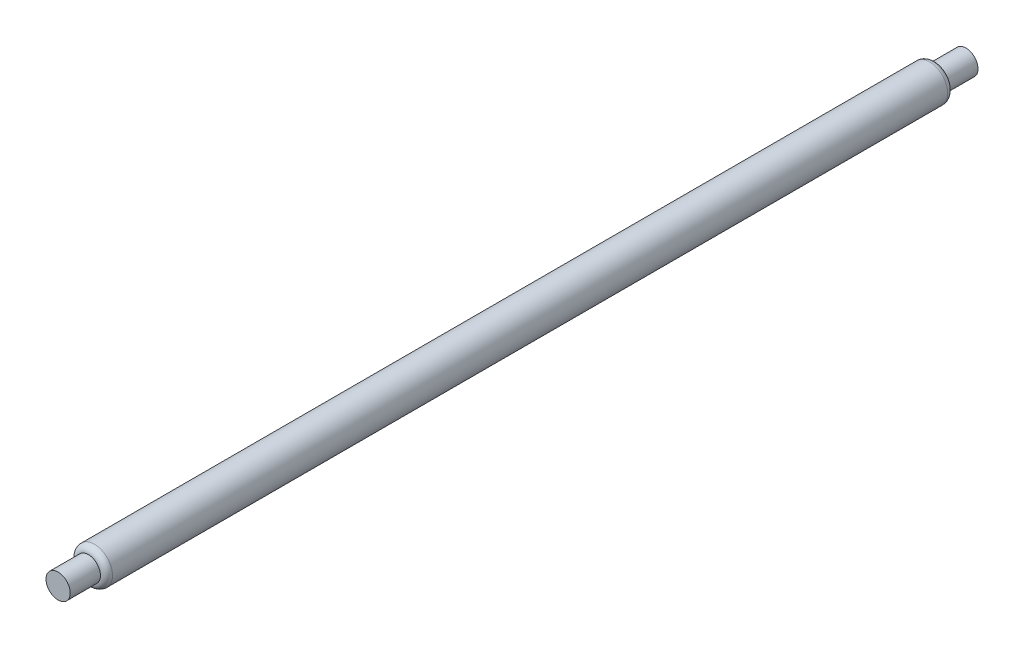
ISO-10303-21;
HEADER;
FILE_DESCRIPTION(('STEP AP214'),'2;1');
FILE_NAME('part.step','',(''),(''),'','','');
FILE_SCHEMA(('AUTOMOTIVE_DESIGN { 1 0 10303 214 1 1 1 1 }'));
ENDSEC;
DATA;
#1=APPLICATION_CONTEXT('core data for automotive mechanical design processes');
#2=APPLICATION_PROTOCOL_DEFINITION('international standard','automotive_design',2000,#1);
#3=PRODUCT_CONTEXT('',#1,'mechanical');
#4=PRODUCT('Part','Part','',(#3));
#5=PRODUCT_RELATED_PRODUCT_CATEGORY('part','',(#4));
#6=PRODUCT_DEFINITION_FORMATION('','',#4);
#7=PRODUCT_DEFINITION_CONTEXT('part definition',#1,'design');
#8=PRODUCT_DEFINITION('design','',#6,#7);
#9=PRODUCT_DEFINITION_SHAPE('','',#8);
#10=(LENGTH_UNIT() NAMED_UNIT(*) SI_UNIT(.MILLI.,.METRE.));
#11=(NAMED_UNIT(*) PLANE_ANGLE_UNIT() SI_UNIT($,.RADIAN.));
#12=(NAMED_UNIT(*) SI_UNIT($,.STERADIAN.) SOLID_ANGLE_UNIT());
#13=UNCERTAINTY_MEASURE_WITH_UNIT(LENGTH_MEASURE(1.E-05),#10,'distance_accuracy_value','');
#14=(GEOMETRIC_REPRESENTATION_CONTEXT(3) GLOBAL_UNCERTAINTY_ASSIGNED_CONTEXT((#13)) GLOBAL_UNIT_ASSIGNED_CONTEXT((#10,
#11,#12)) REPRESENTATION_CONTEXT('',''));
#15=CARTESIAN_POINT('',(0.,0.,0.));
#16=DIRECTION('',(0.,0.,1.));
#17=DIRECTION('',(1.,0.,0.));
#18=AXIS2_PLACEMENT_3D('',#15,#16,#17);
#19=CARTESIAN_POINT('',(0.,0.,150.));
#20=DIRECTION('',(0.,0.,-1.));
#21=DIRECTION('',(-1.,0.,0.));
#22=AXIS2_PLACEMENT_3D('',#19,#20,#21);
#23=CYLINDRICAL_SURFACE('',#22,6.);
#24=CARTESIAN_POINT('',(0.,0.,-138.));
#25=DIRECTION('',(0.,0.,-1.));
#26=DIRECTION('',(-1.,0.,0.));
#27=AXIS2_PLACEMENT_3D('',#24,#25,#26);
#28=CIRCLE('',#27,6.);
#29=CARTESIAN_POINT('',(-6.,0.,-138.));
#30=VERTEX_POINT('',#29);
#31=EDGE_CURVE('E10',#30,#30,#28,.F.);
#32=ORIENTED_EDGE('',*,*,#31,.T.);
#33=EDGE_LOOP('',(#32));
#34=FACE_BOUND('',#33,.T.);
#35=CARTESIAN_POINT('',(0.,0.,138.));
#36=DIRECTION('',(0.,0.,1.));
#37=DIRECTION('',(1.,0.,0.));
#38=AXIS2_PLACEMENT_3D('',#35,#36,#37);
#39=CIRCLE('',#38,6.);
#40=CARTESIAN_POINT('',(6.,0.,138.));
#41=VERTEX_POINT('',#40);
#42=EDGE_CURVE('E37',#41,#41,#39,.F.);
#43=ORIENTED_EDGE('',*,*,#42,.T.);
#44=EDGE_LOOP('',(#43));
#45=FACE_BOUND('',#44,.T.);
#46=ADVANCED_FACE('F30',(#34,#45),#23,.T.);
#47=CARTESIAN_POINT('',(0.,0.,140.));
#48=DIRECTION('',(0.,0.,1.));
#49=DIRECTION('',(1.,0.,0.));
#50=AXIS2_PLACEMENT_3D('',#47,#48,#49);
#51=CYLINDRICAL_SURFACE('',#50,4.);
#52=CARTESIAN_POINT('',(0.,0.,140.));
#53=DIRECTION('',(0.,0.,1.));
#54=DIRECTION('',(1.,0.,0.));
#55=AXIS2_PLACEMENT_3D('',#52,#53,#54);
#56=CIRCLE('',#55,4.);
#57=CARTESIAN_POINT('',(4.,0.,140.));
#58=VERTEX_POINT('',#57);
#59=EDGE_CURVE('E41',#58,#58,#56,.T.);
#60=ORIENTED_EDGE('',*,*,#59,.T.);
#61=EDGE_LOOP('',(#60));
#62=FACE_BOUND('',#61,.T.);
#63=CARTESIAN_POINT('',(0.,0.,150.));
#64=DIRECTION('',(0.,0.,1.));
#65=DIRECTION('',(1.,0.,0.));
#66=AXIS2_PLACEMENT_3D('',#63,#64,#65);
#67=CIRCLE('',#66,4.);
#68=CARTESIAN_POINT('',(4.,0.,150.));
#69=VERTEX_POINT('',#68);
#70=EDGE_CURVE('E45',#69,#69,#67,.T.);
#71=ORIENTED_EDGE('',*,*,#70,.F.);
#72=EDGE_LOOP('',(#71));
#73=FACE_BOUND('',#72,.T.);
#74=ADVANCED_FACE('F75',(#62,#73),#51,.T.);
#75=CARTESIAN_POINT('',(0.,0.,150.));
#76=DIRECTION('',(0.,0.,1.));
#77=DIRECTION('',(1.,0.,0.));
#78=AXIS2_PLACEMENT_3D('',#75,#76,#77);
#79=PLANE('',#78);
#80=ORIENTED_EDGE('',*,*,#70,.T.);
#81=EDGE_LOOP('',(#80));
#82=FACE_BOUND('',#81,.T.);
#83=ADVANCED_FACE('F79',(#82),#79,.T.);
#84=CARTESIAN_POINT('',(0.,0.,138.));
#85=DIRECTION('',(0.,0.,1.));
#86=DIRECTION('',(1.,0.,0.));
#87=AXIS2_PLACEMENT_3D('',#84,#85,#86);
#88=TOROIDAL_SURFACE('',#87,4.,2.);
#89=ORIENTED_EDGE('',*,*,#42,.F.);
#90=EDGE_LOOP('',(#89));
#91=FACE_BOUND('',#90,.T.);
#92=ORIENTED_EDGE('',*,*,#59,.F.);
#93=EDGE_LOOP('',(#92));
#94=FACE_BOUND('',#93,.T.);
#95=ADVANCED_FACE('F63',(#91,#94),#88,.T.);
#96=CARTESIAN_POINT('',(0.,0.,-140.));
#97=DIRECTION('',(0.,0.,-1.));
#98=DIRECTION('',(-1.,0.,0.));
#99=AXIS2_PLACEMENT_3D('',#96,#97,#98);
#100=CYLINDRICAL_SURFACE('',#99,4.);
#101=CARTESIAN_POINT('',(0.,0.,-140.));
#102=DIRECTION('',(0.,0.,1.));
#103=DIRECTION('',(1.,0.,0.));
#104=AXIS2_PLACEMENT_3D('',#101,#102,#103);
#105=CIRCLE('',#104,4.);
#106=CARTESIAN_POINT('',(4.,0.,-140.));
#107=VERTEX_POINT('',#106);
#108=EDGE_CURVE('E49',#107,#107,#105,.T.);
#109=ORIENTED_EDGE('',*,*,#108,.F.);
#110=EDGE_LOOP('',(#109));
#111=FACE_BOUND('',#110,.T.);
#112=CARTESIAN_POINT('',(0.,0.,-150.));
#113=DIRECTION('',(0.,0.,1.));
#114=DIRECTION('',(1.,0.,0.));
#115=AXIS2_PLACEMENT_3D('',#112,#113,#114);
#116=CIRCLE('',#115,4.);
#117=CARTESIAN_POINT('',(4.,0.,-150.));
#118=VERTEX_POINT('',#117);
#119=EDGE_CURVE('E51',#118,#118,#116,.T.);
#120=ORIENTED_EDGE('',*,*,#119,.T.);
#121=EDGE_LOOP('',(#120));
#122=FACE_BOUND('',#121,.T.);
#123=ADVANCED_FACE('F59',(#111,#122),#100,.T.);
#124=CARTESIAN_POINT('',(0.,0.,-150.));
#125=DIRECTION('',(0.,0.,1.));
#126=DIRECTION('',(1.,0.,0.));
#127=AXIS2_PLACEMENT_3D('',#124,#125,#126);
#128=PLANE('',#127);
#129=ORIENTED_EDGE('',*,*,#119,.F.);
#130=EDGE_LOOP('',(#129));
#131=FACE_BOUND('',#130,.T.);
#132=ADVANCED_FACE('F62',(#131),#128,.F.);
#133=CARTESIAN_POINT('',(0.,0.,-138.));
#134=DIRECTION('',(0.,0.,-1.));
#135=DIRECTION('',(-1.,0.,0.));
#136=AXIS2_PLACEMENT_3D('',#133,#134,#135);
#137=TOROIDAL_SURFACE('',#136,4.,2.);
#138=ORIENTED_EDGE('',*,*,#108,.T.);
#139=EDGE_LOOP('',(#138));
#140=FACE_BOUND('',#139,.T.);
#141=ORIENTED_EDGE('',*,*,#31,.F.);
#142=EDGE_LOOP('',(#141));
#143=FACE_BOUND('',#142,.T.);
#144=ADVANCED_FACE('F32',(#140,#143),#137,.T.);
#145=CLOSED_SHELL('',(#46,#74,#83,#95,#123,#132,#144));
#146=MANIFOLD_SOLID_BREP('B2',#145);
#147=ADVANCED_BREP_SHAPE_REPRESENTATION('',(#18,#146),#14);
#148=SHAPE_DEFINITION_REPRESENTATION(#9,#147);
ENDSEC;
END-ISO-10303-21;
